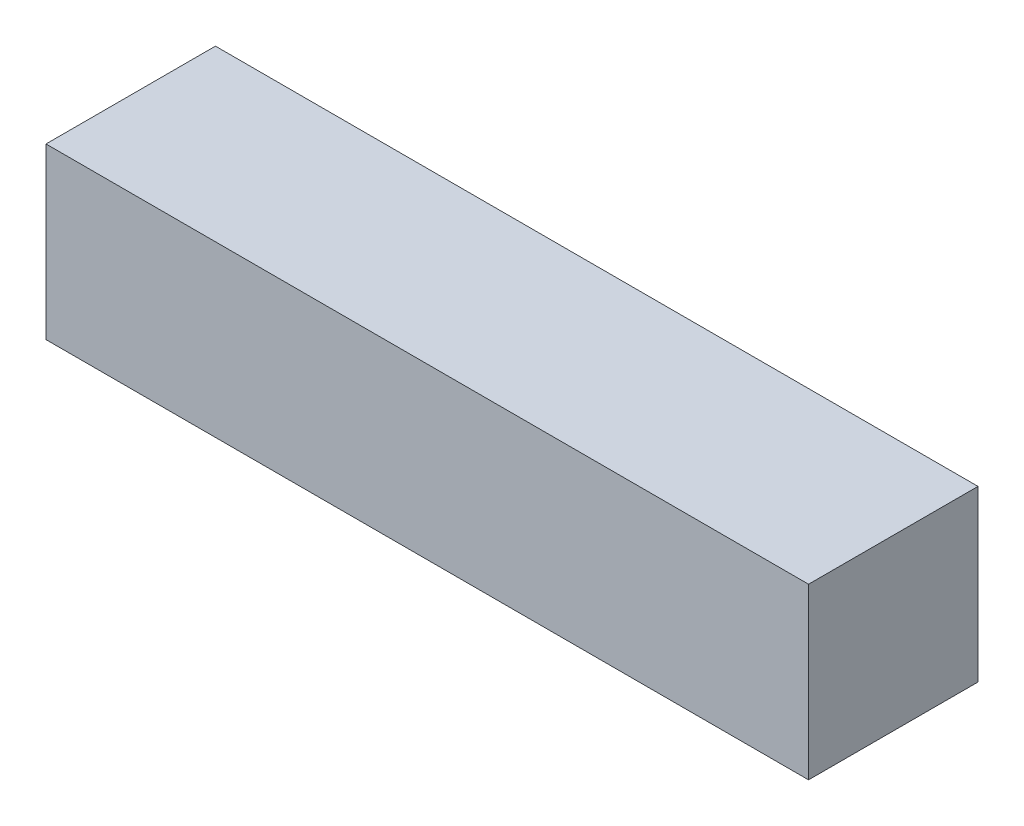
ISO-10303-21;
HEADER;
FILE_DESCRIPTION(('STEP AP214'),'2;1');
FILE_NAME('part.step','',(''),(''),'','','');
FILE_SCHEMA(('AUTOMOTIVE_DESIGN { 1 0 10303 214 1 1 1 1 }'));
ENDSEC;
DATA;
#1=APPLICATION_CONTEXT('core data for automotive mechanical design processes');
#2=APPLICATION_PROTOCOL_DEFINITION('international standard','automotive_design',2000,#1);
#3=PRODUCT_CONTEXT('',#1,'mechanical');
#4=PRODUCT('Part','Part','',(#3));
#5=PRODUCT_RELATED_PRODUCT_CATEGORY('part','',(#4));
#6=PRODUCT_DEFINITION_FORMATION('','',#4);
#7=PRODUCT_DEFINITION_CONTEXT('part definition',#1,'design');
#8=PRODUCT_DEFINITION('design','',#6,#7);
#9=PRODUCT_DEFINITION_SHAPE('','',#8);
#10=(LENGTH_UNIT() NAMED_UNIT(*) SI_UNIT(.MILLI.,.METRE.));
#11=(NAMED_UNIT(*) PLANE_ANGLE_UNIT() SI_UNIT($,.RADIAN.));
#12=(NAMED_UNIT(*) SI_UNIT($,.STERADIAN.) SOLID_ANGLE_UNIT());
#13=UNCERTAINTY_MEASURE_WITH_UNIT(LENGTH_MEASURE(1.E-05),#10,'distance_accuracy_value','');
#14=(GEOMETRIC_REPRESENTATION_CONTEXT(3) GLOBAL_UNCERTAINTY_ASSIGNED_CONTEXT((#13)) GLOBAL_UNIT_ASSIGNED_CONTEXT((#10,
#11,#12)) REPRESENTATION_CONTEXT('',''));
#15=CARTESIAN_POINT('',(0.,0.,0.));
#16=DIRECTION('',(0.,0.,1.));
#17=DIRECTION('',(1.,0.,0.));
#18=AXIS2_PLACEMENT_3D('',#15,#16,#17);
#19=CARTESIAN_POINT('',(180.,0.,0.));
#20=DIRECTION('',(0.,0.,-1.));
#21=DIRECTION('',(-1.,0.,0.));
#22=AXIS2_PLACEMENT_3D('',#19,#20,#21);
#23=PLANE('',#22);
#24=DIRECTION('',(0.,-1.,0.));
#25=VECTOR('',#24,1.);
#26=CARTESIAN_POINT('',(0.,0.,0.));
#27=LINE('',#26,#25);
#28=CARTESIAN_POINT('',(0.,40.,0.));
#29=VERTEX_POINT('',#28);
#30=CARTESIAN_POINT('',(0.,0.,0.));
#31=VERTEX_POINT('',#30);
#32=EDGE_CURVE('E96',#29,#31,#27,.T.);
#33=ORIENTED_EDGE('',*,*,#32,.T.);
#34=DIRECTION('',(-1.,0.,0.));
#35=VECTOR('',#34,1.);
#36=CARTESIAN_POINT('',(180.,0.,0.));
#37=LINE('',#36,#35);
#38=CARTESIAN_POINT('',(180.,0.,0.));
#39=VERTEX_POINT('',#38);
#40=EDGE_CURVE('E11',#39,#31,#37,.T.);
#41=ORIENTED_EDGE('',*,*,#40,.F.);
#42=DIRECTION('',(0.,-1.,0.));
#43=VECTOR('',#42,1.);
#44=CARTESIAN_POINT('',(180.,0.,0.));
#45=LINE('',#44,#43);
#46=CARTESIAN_POINT('',(180.,40.,0.));
#47=VERTEX_POINT('',#46);
#48=EDGE_CURVE('E84',#47,#39,#45,.T.);
#49=ORIENTED_EDGE('',*,*,#48,.F.);
#50=DIRECTION('',(-1.,0.,0.));
#51=VECTOR('',#50,1.);
#52=CARTESIAN_POINT('',(180.,40.,0.));
#53=LINE('',#52,#51);
#54=EDGE_CURVE('E92',#47,#29,#53,.T.);
#55=ORIENTED_EDGE('',*,*,#54,.T.);
#56=EDGE_LOOP('',(#33,#41,#49,#55));
#57=FACE_BOUND('',#56,.T.);
#58=ADVANCED_FACE('F33',(#57),#23,.F.);
#59=CARTESIAN_POINT('',(180.,0.,0.));
#60=DIRECTION('',(0.,1.,0.));
#61=DIRECTION('',(0.,0.,1.));
#62=AXIS2_PLACEMENT_3D('',#59,#60,#61);
#63=PLANE('',#62);
#64=DIRECTION('',(0.,0.,-1.));
#65=VECTOR('',#64,1.);
#66=CARTESIAN_POINT('',(0.,0.,0.));
#67=LINE('',#66,#65);
#68=CARTESIAN_POINT('',(0.,0.,-40.));
#69=VERTEX_POINT('',#68);
#70=EDGE_CURVE('E88',#31,#69,#67,.T.);
#71=ORIENTED_EDGE('',*,*,#70,.T.);
#72=DIRECTION('',(-1.,0.,0.));
#73=VECTOR('',#72,1.);
#74=CARTESIAN_POINT('',(180.,0.,-40.));
#75=LINE('',#74,#73);
#76=CARTESIAN_POINT('',(180.,0.,-40.));
#77=VERTEX_POINT('',#76);
#78=EDGE_CURVE('E41',#77,#69,#75,.T.);
#79=ORIENTED_EDGE('',*,*,#78,.F.);
#80=DIRECTION('',(0.,0.,-1.));
#81=VECTOR('',#80,1.);
#82=CARTESIAN_POINT('',(180.,0.,0.));
#83=LINE('',#82,#81);
#84=EDGE_CURVE('E79',#39,#77,#83,.T.);
#85=ORIENTED_EDGE('',*,*,#84,.F.);
#86=ORIENTED_EDGE('',*,*,#40,.T.);
#87=EDGE_LOOP('',(#71,#79,#85,#86));
#88=FACE_BOUND('',#87,.T.);
#89=ADVANCED_FACE('F87',(#88),#63,.F.);
#90=CARTESIAN_POINT('',(180.,0.,-40.));
#91=DIRECTION('',(0.,0.,1.));
#92=DIRECTION('',(1.,0.,0.));
#93=AXIS2_PLACEMENT_3D('',#90,#91,#92);
#94=PLANE('',#93);
#95=DIRECTION('',(0.,1.,0.));
#96=VECTOR('',#95,1.);
#97=CARTESIAN_POINT('',(0.,0.,-40.));
#98=LINE('',#97,#96);
#99=CARTESIAN_POINT('',(0.,40.,-40.));
#100=VERTEX_POINT('',#99);
#101=EDGE_CURVE('E66',#69,#100,#98,.T.);
#102=ORIENTED_EDGE('',*,*,#101,.T.);
#103=DIRECTION('',(-1.,0.,0.));
#104=VECTOR('',#103,1.);
#105=CARTESIAN_POINT('',(180.,40.,-40.));
#106=LINE('',#105,#104);
#107=CARTESIAN_POINT('',(180.,40.,-40.));
#108=VERTEX_POINT('',#107);
#109=EDGE_CURVE('E89',#108,#100,#106,.T.);
#110=ORIENTED_EDGE('',*,*,#109,.F.);
#111=DIRECTION('',(0.,1.,0.));
#112=VECTOR('',#111,1.);
#113=CARTESIAN_POINT('',(180.,0.,-40.));
#114=LINE('',#113,#112);
#115=EDGE_CURVE('E82',#77,#108,#114,.T.);
#116=ORIENTED_EDGE('',*,*,#115,.F.);
#117=ORIENTED_EDGE('',*,*,#78,.T.);
#118=EDGE_LOOP('',(#102,#110,#116,#117));
#119=FACE_BOUND('',#118,.T.);
#120=ADVANCED_FACE('F90',(#119),#94,.F.);
#121=CARTESIAN_POINT('',(180.,40.,0.));
#122=DIRECTION('',(0.,-1.,0.));
#123=DIRECTION('',(0.,0.,-1.));
#124=AXIS2_PLACEMENT_3D('',#121,#122,#123);
#125=PLANE('',#124);
#126=DIRECTION('',(0.,0.,1.));
#127=VECTOR('',#126,1.);
#128=CARTESIAN_POINT('',(0.,40.,0.));
#129=LINE('',#128,#127);
#130=EDGE_CURVE('E72',#100,#29,#129,.T.);
#131=ORIENTED_EDGE('',*,*,#130,.T.);
#132=ORIENTED_EDGE('',*,*,#54,.F.);
#133=DIRECTION('',(0.,0.,1.));
#134=VECTOR('',#133,1.);
#135=CARTESIAN_POINT('',(180.,40.,0.));
#136=LINE('',#135,#134);
#137=EDGE_CURVE('E49',#108,#47,#136,.T.);
#138=ORIENTED_EDGE('',*,*,#137,.F.);
#139=ORIENTED_EDGE('',*,*,#109,.T.);
#140=EDGE_LOOP('',(#131,#132,#138,#139));
#141=FACE_BOUND('',#140,.T.);
#142=ADVANCED_FACE('F103',(#141),#125,.F.);
#143=CARTESIAN_POINT('',(180.,0.,0.));
#144=DIRECTION('',(-1.,0.,0.));
#145=DIRECTION('',(0.,0.,1.));
#146=AXIS2_PLACEMENT_3D('',#143,#144,#145);
#147=PLANE('',#146);
#148=ORIENTED_EDGE('',*,*,#48,.T.);
#149=ORIENTED_EDGE('',*,*,#84,.T.);
#150=ORIENTED_EDGE('',*,*,#115,.T.);
#151=ORIENTED_EDGE('',*,*,#137,.T.);
#152=EDGE_LOOP('',(#148,#149,#150,#151));
#153=FACE_BOUND('',#152,.T.);
#154=ADVANCED_FACE('F80',(#153),#147,.F.);
#155=CARTESIAN_POINT('',(0.,0.,0.));
#156=DIRECTION('',(-1.,0.,0.));
#157=DIRECTION('',(0.,0.,1.));
#158=AXIS2_PLACEMENT_3D('',#155,#156,#157);
#159=PLANE('',#158);
#160=ORIENTED_EDGE('',*,*,#32,.F.);
#161=ORIENTED_EDGE('',*,*,#130,.F.);
#162=ORIENTED_EDGE('',*,*,#101,.F.);
#163=ORIENTED_EDGE('',*,*,#70,.F.);
#164=EDGE_LOOP('',(#160,#161,#162,#163));
#165=FACE_BOUND('',#164,.T.);
#166=ADVANCED_FACE('F106',(#165),#159,.T.);
#167=CLOSED_SHELL('',(#58,#89,#120,#142,#154,#166));
#168=MANIFOLD_SOLID_BREP('B2',#167);
#169=ADVANCED_BREP_SHAPE_REPRESENTATION('',(#18,#168),#14);
#170=SHAPE_DEFINITION_REPRESENTATION(#9,#169);
ENDSEC;
END-ISO-10303-21;
